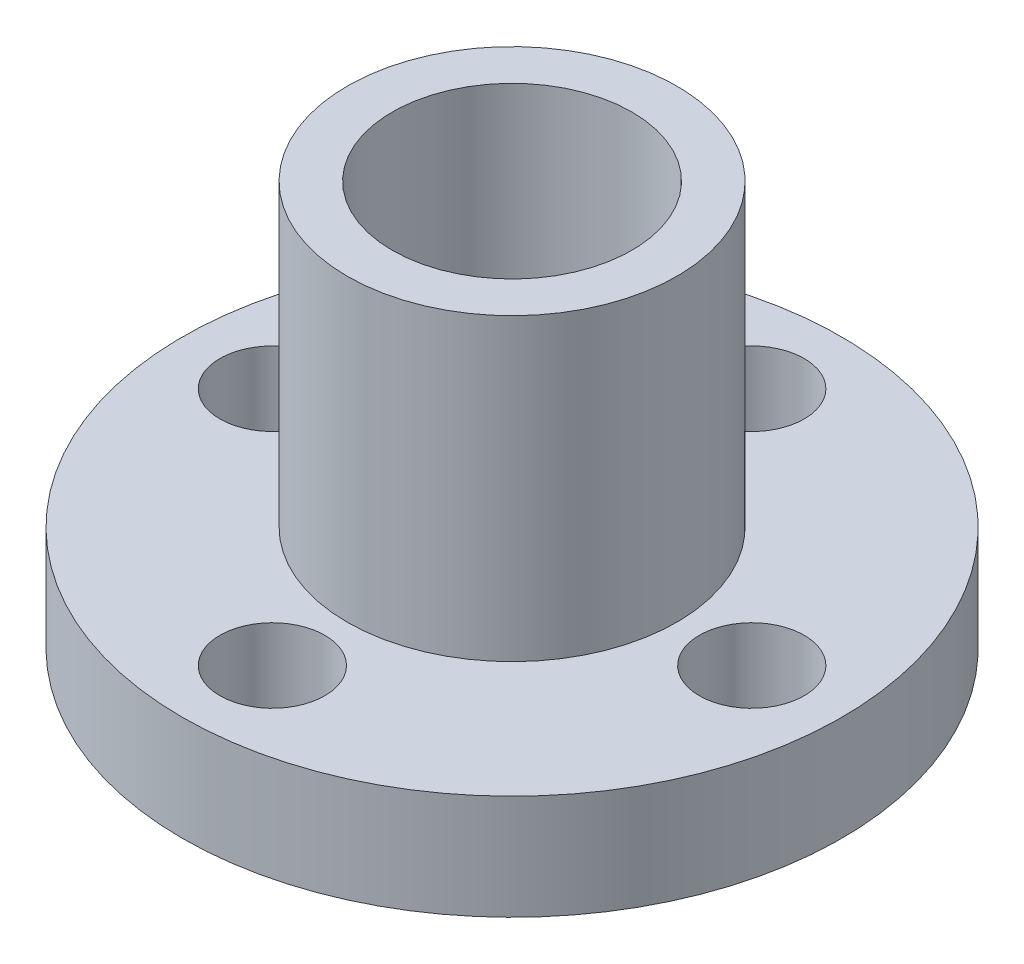
ISO-10303-21;
HEADER;
FILE_DESCRIPTION(('STEP AP214'),'2;1');
FILE_NAME('part.step','',(''),(''),'','','');
FILE_SCHEMA(('AUTOMOTIVE_DESIGN { 1 0 10303 214 1 1 1 1 }'));
ENDSEC;
DATA;
#1=APPLICATION_CONTEXT('core data for automotive mechanical design processes');
#2=APPLICATION_PROTOCOL_DEFINITION('international standard','automotive_design',2000,#1);
#3=PRODUCT_CONTEXT('',#1,'mechanical');
#4=PRODUCT('Part','Part','',(#3));
#5=PRODUCT_RELATED_PRODUCT_CATEGORY('part','',(#4));
#6=PRODUCT_DEFINITION_FORMATION('','',#4);
#7=PRODUCT_DEFINITION_CONTEXT('part definition',#1,'design');
#8=PRODUCT_DEFINITION('design','',#6,#7);
#9=PRODUCT_DEFINITION_SHAPE('','',#8);
#10=(LENGTH_UNIT() NAMED_UNIT(*) SI_UNIT(.MILLI.,.METRE.));
#11=(NAMED_UNIT(*) PLANE_ANGLE_UNIT() SI_UNIT($,.RADIAN.));
#12=(NAMED_UNIT(*) SI_UNIT($,.STERADIAN.) SOLID_ANGLE_UNIT());
#13=UNCERTAINTY_MEASURE_WITH_UNIT(LENGTH_MEASURE(1.E-05),#10,'distance_accuracy_value','');
#14=(GEOMETRIC_REPRESENTATION_CONTEXT(3) GLOBAL_UNCERTAINTY_ASSIGNED_CONTEXT((#13)) GLOBAL_UNIT_ASSIGNED_CONTEXT((#10,
#11,#12)) REPRESENTATION_CONTEXT('',''));
#15=CARTESIAN_POINT('',(0.,0.,0.));
#16=DIRECTION('',(0.,0.,1.));
#17=DIRECTION('',(1.,0.,0.));
#18=AXIS2_PLACEMENT_3D('',#15,#16,#17);
#19=CARTESIAN_POINT('',(0.,5.,0.));
#20=DIRECTION('',(0.,1.,0.));
#21=DIRECTION('',(0.,0.,1.));
#22=AXIS2_PLACEMENT_3D('',#19,#20,#21);
#23=PLANE('',#22);
#24=CARTESIAN_POINT('',(0.,5.,-8.));
#25=DIRECTION('',(0.,1.,0.));
#26=DIRECTION('',(0.,0.,1.));
#27=AXIS2_PLACEMENT_3D('',#24,#25,#26);
#28=CIRCLE('',#27,1.75);
#29=CARTESIAN_POINT('',(0.,5.,-6.25));
#30=VERTEX_POINT('',#29);
#31=EDGE_CURVE('E55',#30,#30,#28,.T.);
#32=ORIENTED_EDGE('',*,*,#31,.F.);
#33=EDGE_LOOP('',(#32));
#34=FACE_BOUND('',#33,.T.);
#35=CARTESIAN_POINT('',(8.00000000000023,5.,-2.26393958003914E-13));
#36=DIRECTION('',(0.,1.,0.));
#37=DIRECTION('',(0.,0.,1.));
#38=AXIS2_PLACEMENT_3D('',#35,#36,#37);
#39=CIRCLE('',#38,1.75000000000018);
#40=CARTESIAN_POINT('',(8.00000000000023,5.,1.74999999999995));
#41=VERTEX_POINT('',#40);
#42=EDGE_CURVE('E137',#41,#41,#39,.T.);
#43=ORIENTED_EDGE('',*,*,#42,.F.);
#44=EDGE_LOOP('',(#43));
#45=FACE_BOUND('',#44,.T.);
#46=CARTESIAN_POINT('',(4.52787916007828E-13,5.,8.));
#47=DIRECTION('',(0.,1.,0.));
#48=DIRECTION('',(0.,0.,1.));
#49=AXIS2_PLACEMENT_3D('',#46,#47,#48);
#50=CIRCLE('',#49,1.75000000000049);
#51=CARTESIAN_POINT('',(4.52787916007828E-13,5.,9.75000000000048));
#52=VERTEX_POINT('',#51);
#53=EDGE_CURVE('E140',#52,#52,#50,.T.);
#54=ORIENTED_EDGE('',*,*,#53,.F.);
#55=EDGE_LOOP('',(#54));
#56=FACE_BOUND('',#55,.T.);
#57=CARTESIAN_POINT('',(-7.99999999999977,5.,2.27373675443232E-13));
#58=DIRECTION('',(0.,1.,0.));
#59=DIRECTION('',(0.,0.,1.));
#60=AXIS2_PLACEMENT_3D('',#57,#58,#59);
#61=CIRCLE('',#60,1.75000000000036);
#62=CARTESIAN_POINT('',(-7.99999999999977,5.,1.75000000000059));
#63=VERTEX_POINT('',#62);
#64=EDGE_CURVE('E75',#63,#63,#61,.T.);
#65=ORIENTED_EDGE('',*,*,#64,.F.);
#66=EDGE_LOOP('',(#65));
#67=FACE_BOUND('',#66,.T.);
#68=CARTESIAN_POINT('',(0.,5.,0.));
#69=DIRECTION('',(0.,1.,0.));
#70=DIRECTION('',(0.,0.,1.));
#71=AXIS2_PLACEMENT_3D('',#68,#69,#70);
#72=CIRCLE('',#71,11.);
#73=CARTESIAN_POINT('',(0.,5.,11.));
#74=VERTEX_POINT('',#73);
#75=EDGE_CURVE('E80',#74,#74,#72,.T.);
#76=ORIENTED_EDGE('',*,*,#75,.T.);
#77=EDGE_LOOP('',(#76));
#78=FACE_BOUND('',#77,.T.);
#79=CARTESIAN_POINT('',(0.,5.,0.));
#80=DIRECTION('',(0.,1.,0.));
#81=DIRECTION('',(0.,0.,1.));
#82=AXIS2_PLACEMENT_3D('',#79,#80,#81);
#83=CIRCLE('',#82,5.5);
#84=CARTESIAN_POINT('',(0.,5.,5.5));
#85=VERTEX_POINT('',#84);
#86=EDGE_CURVE('E66',#85,#85,#83,.T.);
#87=ORIENTED_EDGE('',*,*,#86,.F.);
#88=EDGE_LOOP('',(#87));
#89=FACE_BOUND('',#88,.T.);
#90=ADVANCED_FACE('F33',(#34,#45,#56,#67,#78,#89),#23,.T.);
#91=CARTESIAN_POINT('',(0.,0.,0.));
#92=DIRECTION('',(0.,1.,0.));
#93=DIRECTION('',(0.,0.,1.));
#94=AXIS2_PLACEMENT_3D('',#91,#92,#93);
#95=PLANE('',#94);
#96=CARTESIAN_POINT('',(0.,0.,0.));
#97=DIRECTION('',(0.,1.,0.));
#98=DIRECTION('',(0.,0.,1.));
#99=AXIS2_PLACEMENT_3D('',#96,#97,#98);
#100=CIRCLE('',#99,5.5);
#101=CARTESIAN_POINT('',(0.,0.,5.5));
#102=VERTEX_POINT('',#101);
#103=EDGE_CURVE('E41',#102,#102,#100,.T.);
#104=ORIENTED_EDGE('',*,*,#103,.F.);
#105=EDGE_LOOP('',(#104));
#106=FACE_BOUND('',#105,.T.);
#107=CARTESIAN_POINT('',(0.,0.,0.));
#108=DIRECTION('',(0.,1.,0.));
#109=DIRECTION('',(0.,0.,1.));
#110=AXIS2_PLACEMENT_3D('',#107,#108,#109);
#111=CIRCLE('',#110,4.);
#112=CARTESIAN_POINT('',(0.,0.,4.));
#113=VERTEX_POINT('',#112);
#114=EDGE_CURVE('E46',#113,#113,#111,.T.);
#115=ORIENTED_EDGE('',*,*,#114,.T.);
#116=EDGE_LOOP('',(#115));
#117=FACE_BOUND('',#116,.T.);
#118=ADVANCED_FACE('F102',(#106,#117),#95,.F.);
#119=CARTESIAN_POINT('',(0.,1.5,0.));
#120=DIRECTION('',(0.,-1.,0.));
#121=DIRECTION('',(0.,0.,-1.));
#122=AXIS2_PLACEMENT_3D('',#119,#120,#121);
#123=CYLINDRICAL_SURFACE('',#122,5.5);
#124=CARTESIAN_POINT('',(0.,1.5,0.));
#125=DIRECTION('',(0.,1.,0.));
#126=DIRECTION('',(0.,0.,1.));
#127=AXIS2_PLACEMENT_3D('',#124,#125,#126);
#128=CIRCLE('',#127,5.5);
#129=CARTESIAN_POINT('',(0.,1.5,5.5));
#130=VERTEX_POINT('',#129);
#131=EDGE_CURVE('E10',#130,#130,#128,.T.);
#132=ORIENTED_EDGE('',*,*,#131,.F.);
#133=EDGE_LOOP('',(#132));
#134=FACE_BOUND('',#133,.T.);
#135=ORIENTED_EDGE('',*,*,#103,.T.);
#136=EDGE_LOOP('',(#135));
#137=FACE_BOUND('',#136,.T.);
#138=ADVANCED_FACE('F35',(#134,#137),#123,.T.);
#139=CARTESIAN_POINT('',(0.,1.5,0.));
#140=DIRECTION('',(0.,-1.,0.));
#141=DIRECTION('',(0.,0.,-1.));
#142=AXIS2_PLACEMENT_3D('',#139,#140,#141);
#143=CYLINDRICAL_SURFACE('',#142,4.);
#144=ORIENTED_EDGE('',*,*,#114,.F.);
#145=EDGE_LOOP('',(#144));
#146=FACE_BOUND('',#145,.T.);
#147=CARTESIAN_POINT('',(0.,15.,0.));
#148=DIRECTION('',(0.,1.,0.));
#149=DIRECTION('',(0.,0.,1.));
#150=AXIS2_PLACEMENT_3D('',#147,#148,#149);
#151=CIRCLE('',#150,4.);
#152=CARTESIAN_POINT('',(0.,15.,4.));
#153=VERTEX_POINT('',#152);
#154=EDGE_CURVE('E62',#153,#153,#151,.T.);
#155=ORIENTED_EDGE('',*,*,#154,.T.);
#156=EDGE_LOOP('',(#155));
#157=FACE_BOUND('',#156,.T.);
#158=ADVANCED_FACE('F89',(#146,#157),#143,.F.);
#159=CARTESIAN_POINT('',(0.,1.5,0.));
#160=DIRECTION('',(0.,1.,0.));
#161=DIRECTION('',(0.,0.,1.));
#162=AXIS2_PLACEMENT_3D('',#159,#160,#161);
#163=PLANE('',#162);
#164=CARTESIAN_POINT('',(0.,1.5,-8.));
#165=DIRECTION('',(0.,1.,0.));
#166=DIRECTION('',(0.,0.,1.));
#167=AXIS2_PLACEMENT_3D('',#164,#165,#166);
#168=CIRCLE('',#167,1.75);
#169=CARTESIAN_POINT('',(0.,1.5,-6.25));
#170=VERTEX_POINT('',#169);
#171=EDGE_CURVE('E37',#170,#170,#168,.T.);
#172=ORIENTED_EDGE('',*,*,#171,.T.);
#173=EDGE_LOOP('',(#172));
#174=FACE_BOUND('',#173,.T.);
#175=CARTESIAN_POINT('',(8.00000000000023,1.5,-2.26393958003914E-13));
#176=DIRECTION('',(0.,1.,0.));
#177=DIRECTION('',(0.,0.,1.));
#178=AXIS2_PLACEMENT_3D('',#175,#176,#177);
#179=CIRCLE('',#178,1.75000000000018);
#180=CARTESIAN_POINT('',(8.00000000000023,1.5,1.74999999999995));
#181=VERTEX_POINT('',#180);
#182=EDGE_CURVE('E57',#181,#181,#179,.T.);
#183=ORIENTED_EDGE('',*,*,#182,.T.);
#184=EDGE_LOOP('',(#183));
#185=FACE_BOUND('',#184,.T.);
#186=CARTESIAN_POINT('',(4.52787916007828E-13,1.5,8.));
#187=DIRECTION('',(0.,1.,0.));
#188=DIRECTION('',(0.,0.,1.));
#189=AXIS2_PLACEMENT_3D('',#186,#187,#188);
#190=CIRCLE('',#189,1.75000000000049);
#191=CARTESIAN_POINT('',(4.52787916007828E-13,1.5,9.75000000000048));
#192=VERTEX_POINT('',#191);
#193=EDGE_CURVE('E54',#192,#192,#190,.T.);
#194=ORIENTED_EDGE('',*,*,#193,.T.);
#195=EDGE_LOOP('',(#194));
#196=FACE_BOUND('',#195,.T.);
#197=CARTESIAN_POINT('',(-7.99999999999977,1.5,2.27373675443232E-13));
#198=DIRECTION('',(0.,1.,0.));
#199=DIRECTION('',(0.,0.,1.));
#200=AXIS2_PLACEMENT_3D('',#197,#198,#199);
#201=CIRCLE('',#200,1.75000000000036);
#202=CARTESIAN_POINT('',(-7.99999999999977,1.5,1.75000000000059));
#203=VERTEX_POINT('',#202);
#204=EDGE_CURVE('E51',#203,#203,#201,.T.);
#205=ORIENTED_EDGE('',*,*,#204,.T.);
#206=EDGE_LOOP('',(#205));
#207=FACE_BOUND('',#206,.T.);
#208=ORIENTED_EDGE('',*,*,#131,.T.);
#209=EDGE_LOOP('',(#208));
#210=FACE_BOUND('',#209,.T.);
#211=CARTESIAN_POINT('',(0.,1.5,0.));
#212=DIRECTION('',(0.,1.,0.));
#213=DIRECTION('',(0.,0.,1.));
#214=AXIS2_PLACEMENT_3D('',#211,#212,#213);
#215=CIRCLE('',#214,11.);
#216=CARTESIAN_POINT('',(0.,1.5,11.));
#217=VERTEX_POINT('',#216);
#218=EDGE_CURVE('E78',#217,#217,#215,.T.);
#219=ORIENTED_EDGE('',*,*,#218,.F.);
#220=EDGE_LOOP('',(#219));
#221=FACE_BOUND('',#220,.T.);
#222=ADVANCED_FACE('F87',(#174,#185,#196,#207,#210,#221),#163,.F.);
#223=CARTESIAN_POINT('',(0.,5.,0.));
#224=DIRECTION('',(0.,-1.,0.));
#225=DIRECTION('',(0.,0.,-1.));
#226=AXIS2_PLACEMENT_3D('',#223,#224,#225);
#227=CYLINDRICAL_SURFACE('',#226,11.);
#228=ORIENTED_EDGE('',*,*,#75,.F.);
#229=EDGE_LOOP('',(#228));
#230=FACE_BOUND('',#229,.T.);
#231=ORIENTED_EDGE('',*,*,#218,.T.);
#232=EDGE_LOOP('',(#231));
#233=FACE_BOUND('',#232,.T.);
#234=ADVANCED_FACE('F85',(#230,#233),#227,.T.);
#235=CARTESIAN_POINT('',(0.,15.,0.));
#236=DIRECTION('',(0.,1.,0.));
#237=DIRECTION('',(0.,0.,1.));
#238=AXIS2_PLACEMENT_3D('',#235,#236,#237);
#239=PLANE('',#238);
#240=CARTESIAN_POINT('',(0.,15.,0.));
#241=DIRECTION('',(0.,1.,0.));
#242=DIRECTION('',(0.,0.,1.));
#243=AXIS2_PLACEMENT_3D('',#240,#241,#242);
#244=CIRCLE('',#243,5.5);
#245=CARTESIAN_POINT('',(0.,15.,5.5));
#246=VERTEX_POINT('',#245);
#247=EDGE_CURVE('E71',#246,#246,#244,.T.);
#248=ORIENTED_EDGE('',*,*,#247,.T.);
#249=EDGE_LOOP('',(#248));
#250=FACE_BOUND('',#249,.T.);
#251=ORIENTED_EDGE('',*,*,#154,.F.);
#252=EDGE_LOOP('',(#251));
#253=FACE_BOUND('',#252,.T.);
#254=ADVANCED_FACE('F95',(#250,#253),#239,.T.);
#255=CARTESIAN_POINT('',(0.,15.,0.));
#256=DIRECTION('',(0.,-1.,0.));
#257=DIRECTION('',(0.,0.,-1.));
#258=AXIS2_PLACEMENT_3D('',#255,#256,#257);
#259=CYLINDRICAL_SURFACE('',#258,5.5);
#260=ORIENTED_EDGE('',*,*,#247,.F.);
#261=EDGE_LOOP('',(#260));
#262=FACE_BOUND('',#261,.T.);
#263=ORIENTED_EDGE('',*,*,#86,.T.);
#264=EDGE_LOOP('',(#263));
#265=FACE_BOUND('',#264,.T.);
#266=ADVANCED_FACE('F111',(#262,#265),#259,.T.);
#267=CARTESIAN_POINT('',(-7.99999999999977,0.,2.27373675443232E-13));
#268=DIRECTION('',(0.,1.,0.));
#269=DIRECTION('',(0.,0.,1.));
#270=AXIS2_PLACEMENT_3D('',#267,#268,#269);
#271=CYLINDRICAL_SURFACE('',#270,1.75000000000036);
#272=ORIENTED_EDGE('',*,*,#64,.T.);
#273=EDGE_LOOP('',(#272));
#274=FACE_BOUND('',#273,.T.);
#275=ORIENTED_EDGE('',*,*,#204,.F.);
#276=EDGE_LOOP('',(#275));
#277=FACE_BOUND('',#276,.T.);
#278=ADVANCED_FACE('F114',(#274,#277),#271,.F.);
#279=CARTESIAN_POINT('',(4.52787916007828E-13,0.,8.));
#280=DIRECTION('',(0.,1.,0.));
#281=DIRECTION('',(0.,0.,1.));
#282=AXIS2_PLACEMENT_3D('',#279,#280,#281);
#283=CYLINDRICAL_SURFACE('',#282,1.75000000000049);
#284=ORIENTED_EDGE('',*,*,#53,.T.);
#285=EDGE_LOOP('',(#284));
#286=FACE_BOUND('',#285,.T.);
#287=ORIENTED_EDGE('',*,*,#193,.F.);
#288=EDGE_LOOP('',(#287));
#289=FACE_BOUND('',#288,.T.);
#290=ADVANCED_FACE('F121',(#286,#289),#283,.F.);
#291=CARTESIAN_POINT('',(8.00000000000023,0.,-2.26393958003914E-13));
#292=DIRECTION('',(0.,1.,0.));
#293=DIRECTION('',(0.,0.,1.));
#294=AXIS2_PLACEMENT_3D('',#291,#292,#293);
#295=CYLINDRICAL_SURFACE('',#294,1.75000000000018);
#296=ORIENTED_EDGE('',*,*,#42,.T.);
#297=EDGE_LOOP('',(#296));
#298=FACE_BOUND('',#297,.T.);
#299=ORIENTED_EDGE('',*,*,#182,.F.);
#300=EDGE_LOOP('',(#299));
#301=FACE_BOUND('',#300,.T.);
#302=ADVANCED_FACE('F125',(#298,#301),#295,.F.);
#303=CARTESIAN_POINT('',(0.,0.,-8.));
#304=DIRECTION('',(0.,1.,0.));
#305=DIRECTION('',(0.,0.,1.));
#306=AXIS2_PLACEMENT_3D('',#303,#304,#305);
#307=CYLINDRICAL_SURFACE('',#306,1.75);
#308=ORIENTED_EDGE('',*,*,#31,.T.);
#309=EDGE_LOOP('',(#308));
#310=FACE_BOUND('',#309,.T.);
#311=ORIENTED_EDGE('',*,*,#171,.F.);
#312=EDGE_LOOP('',(#311));
#313=FACE_BOUND('',#312,.T.);
#314=ADVANCED_FACE('F129',(#310,#313),#307,.F.);
#315=CLOSED_SHELL('',(#90,#118,#138,#158,#222,#234,#254,#266,#278,#290,#302,#314));
#316=MANIFOLD_SOLID_BREP('B2',#315);
#317=ADVANCED_BREP_SHAPE_REPRESENTATION('',(#18,#316),#14);
#318=SHAPE_DEFINITION_REPRESENTATION(#9,#317);
ENDSEC;
END-ISO-10303-21;
